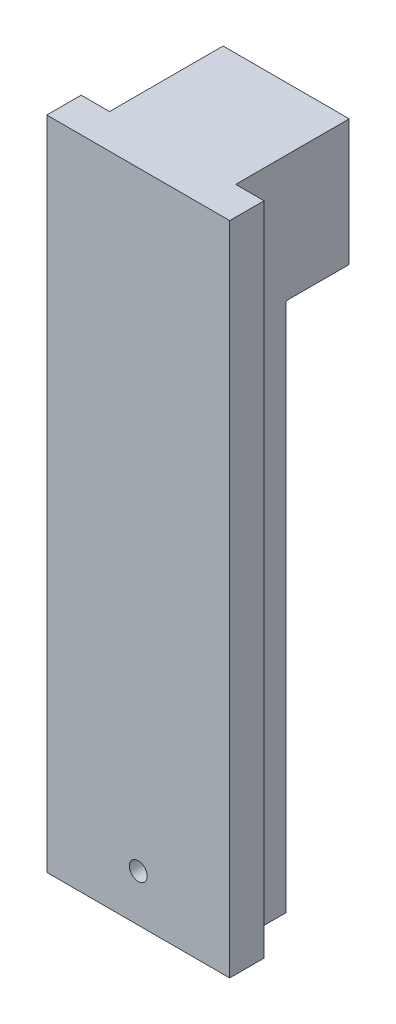
ISO-10303-21;
HEADER;
FILE_DESCRIPTION(('STEP AP214'),'2;1');
FILE_NAME('part.step','',(''),(''),'','','');
FILE_SCHEMA(('AUTOMOTIVE_DESIGN { 1 0 10303 214 1 1 1 1 }'));
ENDSEC;
DATA;
#1=APPLICATION_CONTEXT('core data for automotive mechanical design processes');
#2=APPLICATION_PROTOCOL_DEFINITION('international standard','automotive_design',2000,#1);
#3=PRODUCT_CONTEXT('',#1,'mechanical');
#4=PRODUCT('Part','Part','',(#3));
#5=PRODUCT_RELATED_PRODUCT_CATEGORY('part','',(#4));
#6=PRODUCT_DEFINITION_FORMATION('','',#4);
#7=PRODUCT_DEFINITION_CONTEXT('part definition',#1,'design');
#8=PRODUCT_DEFINITION('design','',#6,#7);
#9=PRODUCT_DEFINITION_SHAPE('','',#8);
#10=(LENGTH_UNIT() NAMED_UNIT(*) SI_UNIT(.MILLI.,.METRE.));
#11=(NAMED_UNIT(*) PLANE_ANGLE_UNIT() SI_UNIT($,.RADIAN.));
#12=(NAMED_UNIT(*) SI_UNIT($,.STERADIAN.) SOLID_ANGLE_UNIT());
#13=UNCERTAINTY_MEASURE_WITH_UNIT(LENGTH_MEASURE(1.E-05),#10,'distance_accuracy_value','');
#14=(GEOMETRIC_REPRESENTATION_CONTEXT(3) GLOBAL_UNCERTAINTY_ASSIGNED_CONTEXT((#13)) GLOBAL_UNIT_ASSIGNED_CONTEXT((#10,
#11,#12)) REPRESENTATION_CONTEXT('',''));
#15=CARTESIAN_POINT('',(0.,0.,0.));
#16=DIRECTION('',(0.,0.,1.));
#17=DIRECTION('',(1.,0.,0.));
#18=AXIS2_PLACEMENT_3D('',#15,#16,#17);
#19=CARTESIAN_POINT('',(10.,104.,-13.45));
#20=DIRECTION('',(0.,0.,1.));
#21=DIRECTION('',(1.,0.,0.));
#22=AXIS2_PLACEMENT_3D('',#19,#20,#21);
#23=PLANE('',#22);
#24=CARTESIAN_POINT('',(0.,7.425,-13.45));
#25=DIRECTION('',(0.,0.,1.));
#26=DIRECTION('',(1.,0.,0.));
#27=AXIS2_PLACEMENT_3D('',#24,#25,#26);
#28=CIRCLE('',#27,1.425);
#29=CARTESIAN_POINT('',(1.425,7.425,-13.45));
#30=VERTEX_POINT('',#29);
#31=EDGE_CURVE('E345',#30,#30,#28,.T.);
#32=ORIENTED_EDGE('',*,*,#31,.T.);
#33=EDGE_LOOP('',(#32));
#34=FACE_BOUND('',#33,.T.);
#35=DIRECTION('',(-1.,0.,0.));
#36=VECTOR('',#35,1.);
#37=CARTESIAN_POINT('',(-10.,84.,-13.45));
#38=LINE('',#37,#36);
#39=CARTESIAN_POINT('',(10.,84.,-13.45));
#40=VERTEX_POINT('',#39);
#41=CARTESIAN_POINT('',(-10.,84.,-13.45));
#42=VERTEX_POINT('',#41);
#43=EDGE_CURVE('E61',#40,#42,#38,.T.);
#44=ORIENTED_EDGE('',*,*,#43,.F.);
#45=DIRECTION('',(0.,-1.,0.));
#46=VECTOR('',#45,1.);
#47=CARTESIAN_POINT('',(10.,104.,-13.45));
#48=LINE('',#47,#46);
#49=CARTESIAN_POINT('',(10.,0.,-13.45));
#50=VERTEX_POINT('',#49);
#51=EDGE_CURVE('E145',#40,#50,#48,.T.);
#52=ORIENTED_EDGE('',*,*,#51,.T.);
#53=DIRECTION('',(-1.,0.,0.));
#54=VECTOR('',#53,1.);
#55=CARTESIAN_POINT('',(10.,0.,-13.45));
#56=LINE('',#55,#54);
#57=CARTESIAN_POINT('',(-10.,0.,-13.45));
#58=VERTEX_POINT('',#57);
#59=EDGE_CURVE('E178',#50,#58,#56,.T.);
#60=ORIENTED_EDGE('',*,*,#59,.T.);
#61=DIRECTION('',(0.,-1.,0.));
#62=VECTOR('',#61,1.);
#63=CARTESIAN_POINT('',(-10.,104.,-13.45));
#64=LINE('',#63,#62);
#65=EDGE_CURVE('E193',#42,#58,#64,.T.);
#66=ORIENTED_EDGE('',*,*,#65,.F.);
#67=EDGE_LOOP('',(#44,#52,#60,#66));
#68=FACE_BOUND('',#67,.T.);
#69=ADVANCED_FACE('F45',(#34,#68),#23,.F.);
#70=CARTESIAN_POINT('',(-14.5,104.,-5.45));
#71=DIRECTION('',(1.,0.,0.));
#72=DIRECTION('',(0.,0.,-1.));
#73=AXIS2_PLACEMENT_3D('',#70,#71,#72);
#74=PLANE('',#73);
#75=DIRECTION('',(0.,0.,1.));
#76=VECTOR('',#75,1.);
#77=CARTESIAN_POINT('',(-14.5,0.,-5.45));
#78=LINE('',#77,#76);
#79=CARTESIAN_POINT('',(-14.5,0.,-5.45));
#80=VERTEX_POINT('',#79);
#81=CARTESIAN_POINT('',(-14.5,0.,0.));
#82=VERTEX_POINT('',#81);
#83=EDGE_CURVE('E162',#80,#82,#78,.T.);
#84=ORIENTED_EDGE('',*,*,#83,.T.);
#85=DIRECTION('',(0.,-1.,0.));
#86=VECTOR('',#85,1.);
#87=CARTESIAN_POINT('',(-14.5,104.,0.));
#88=LINE('',#87,#86);
#89=CARTESIAN_POINT('',(-14.5,104.,0.));
#90=VERTEX_POINT('',#89);
#91=EDGE_CURVE('E11',#90,#82,#88,.T.);
#92=ORIENTED_EDGE('',*,*,#91,.F.);
#93=DIRECTION('',(0.,0.,1.));
#94=VECTOR('',#93,1.);
#95=CARTESIAN_POINT('',(-14.5,104.,-5.45));
#96=LINE('',#95,#94);
#97=CARTESIAN_POINT('',(-14.5,104.,-5.45));
#98=VERTEX_POINT('',#97);
#99=EDGE_CURVE('E187',#98,#90,#96,.T.);
#100=ORIENTED_EDGE('',*,*,#99,.F.);
#101=DIRECTION('',(0.,-1.,0.));
#102=VECTOR('',#101,1.);
#103=CARTESIAN_POINT('',(-14.5,104.,-5.45));
#104=LINE('',#103,#102);
#105=EDGE_CURVE('E161',#98,#80,#104,.T.);
#106=ORIENTED_EDGE('',*,*,#105,.T.);
#107=EDGE_LOOP('',(#84,#92,#100,#106));
#108=FACE_BOUND('',#107,.T.);
#109=ADVANCED_FACE('F47',(#108),#74,.F.);
#110=CARTESIAN_POINT('',(-14.5,104.,0.));
#111=DIRECTION('',(0.,0.,-1.));
#112=DIRECTION('',(-1.,0.,0.));
#113=AXIS2_PLACEMENT_3D('',#110,#111,#112);
#114=PLANE('',#113);
#115=CARTESIAN_POINT('',(0.,7.425,0.));
#116=DIRECTION('',(0.,0.,1.));
#117=DIRECTION('',(1.,0.,0.));
#118=AXIS2_PLACEMENT_3D('',#115,#116,#117);
#119=CIRCLE('',#118,1.425);
#120=CARTESIAN_POINT('',(1.425,7.425,0.));
#121=VERTEX_POINT('',#120);
#122=EDGE_CURVE('E343',#121,#121,#119,.T.);
#123=ORIENTED_EDGE('',*,*,#122,.F.);
#124=EDGE_LOOP('',(#123));
#125=FACE_BOUND('',#124,.T.);
#126=DIRECTION('',(1.,0.,0.));
#127=VECTOR('',#126,1.);
#128=CARTESIAN_POINT('',(-14.5,0.,0.));
#129=LINE('',#128,#127);
#130=CARTESIAN_POINT('',(14.5,0.,0.));
#131=VERTEX_POINT('',#130);
#132=EDGE_CURVE('E166',#82,#131,#129,.T.);
#133=ORIENTED_EDGE('',*,*,#132,.T.);
#134=DIRECTION('',(0.,-1.,0.));
#135=VECTOR('',#134,1.);
#136=CARTESIAN_POINT('',(14.5,104.,0.));
#137=LINE('',#136,#135);
#138=CARTESIAN_POINT('',(14.5,104.,0.));
#139=VERTEX_POINT('',#138);
#140=EDGE_CURVE('E54',#139,#131,#137,.T.);
#141=ORIENTED_EDGE('',*,*,#140,.F.);
#142=DIRECTION('',(1.,0.,0.));
#143=VECTOR('',#142,1.);
#144=CARTESIAN_POINT('',(-14.5,104.,0.));
#145=LINE('',#144,#143);
#146=EDGE_CURVE('E110',#90,#139,#145,.T.);
#147=ORIENTED_EDGE('',*,*,#146,.F.);
#148=ORIENTED_EDGE('',*,*,#91,.T.);
#149=EDGE_LOOP('',(#133,#141,#147,#148));
#150=FACE_BOUND('',#149,.T.);
#151=ADVANCED_FACE('F233',(#125,#150),#114,.F.);
#152=CARTESIAN_POINT('',(14.5,104.,0.));
#153=DIRECTION('',(-1.,0.,0.));
#154=DIRECTION('',(0.,0.,1.));
#155=AXIS2_PLACEMENT_3D('',#152,#153,#154);
#156=PLANE('',#155);
#157=DIRECTION('',(0.,0.,-1.));
#158=VECTOR('',#157,1.);
#159=CARTESIAN_POINT('',(14.5,0.,0.));
#160=LINE('',#159,#158);
#161=CARTESIAN_POINT('',(14.5,0.,-5.45000000000001));
#162=VERTEX_POINT('',#161);
#163=EDGE_CURVE('E170',#131,#162,#160,.T.);
#164=ORIENTED_EDGE('',*,*,#163,.T.);
#165=DIRECTION('',(0.,-1.,0.));
#166=VECTOR('',#165,1.);
#167=CARTESIAN_POINT('',(14.5,104.,-5.45000000000001));
#168=LINE('',#167,#166);
#169=CARTESIAN_POINT('',(14.5,104.,-5.45000000000001));
#170=VERTEX_POINT('',#169);
#171=EDGE_CURVE('E144',#170,#162,#168,.T.);
#172=ORIENTED_EDGE('',*,*,#171,.F.);
#173=DIRECTION('',(0.,0.,-1.));
#174=VECTOR('',#173,1.);
#175=CARTESIAN_POINT('',(14.5,104.,0.));
#176=LINE('',#175,#174);
#177=EDGE_CURVE('E129',#139,#170,#176,.T.);
#178=ORIENTED_EDGE('',*,*,#177,.F.);
#179=ORIENTED_EDGE('',*,*,#140,.T.);
#180=EDGE_LOOP('',(#164,#172,#178,#179));
#181=FACE_BOUND('',#180,.T.);
#182=ADVANCED_FACE('F203',(#181),#156,.F.);
#183=CARTESIAN_POINT('',(14.5,104.,-5.45000000000001));
#184=DIRECTION('',(0.,0.,1.));
#185=DIRECTION('',(1.,0.,0.));
#186=AXIS2_PLACEMENT_3D('',#183,#184,#185);
#187=PLANE('',#186);
#188=DIRECTION('',(-1.,0.,0.));
#189=VECTOR('',#188,1.);
#190=CARTESIAN_POINT('',(14.5,0.,-5.45000000000001));
#191=LINE('',#190,#189);
#192=CARTESIAN_POINT('',(10.,0.,-5.45000000000001));
#193=VERTEX_POINT('',#192);
#194=EDGE_CURVE('E139',#162,#193,#191,.T.);
#195=ORIENTED_EDGE('',*,*,#194,.T.);
#196=DIRECTION('',(0.,-1.,0.));
#197=VECTOR('',#196,1.);
#198=CARTESIAN_POINT('',(10.,104.,-5.45000000000001));
#199=LINE('',#198,#197);
#200=CARTESIAN_POINT('',(10.,104.,-5.45000000000001));
#201=VERTEX_POINT('',#200);
#202=EDGE_CURVE('E136',#201,#193,#199,.T.);
#203=ORIENTED_EDGE('',*,*,#202,.F.);
#204=DIRECTION('',(-1.,0.,0.));
#205=VECTOR('',#204,1.);
#206=CARTESIAN_POINT('',(14.5,104.,-5.45000000000001));
#207=LINE('',#206,#205);
#208=EDGE_CURVE('E121',#170,#201,#207,.T.);
#209=ORIENTED_EDGE('',*,*,#208,.F.);
#210=ORIENTED_EDGE('',*,*,#171,.T.);
#211=EDGE_LOOP('',(#195,#203,#209,#210));
#212=FACE_BOUND('',#211,.T.);
#213=ADVANCED_FACE('F137',(#212),#187,.F.);
#214=CARTESIAN_POINT('',(10.,104.,-5.45000000000001));
#215=DIRECTION('',(-1.,0.,0.));
#216=DIRECTION('',(0.,0.,1.));
#217=AXIS2_PLACEMENT_3D('',#214,#215,#216);
#218=PLANE('',#217);
#219=DIRECTION('',(0.,0.,-1.));
#220=VECTOR('',#219,1.);
#221=CARTESIAN_POINT('',(10.,0.,-5.45000000000001));
#222=LINE('',#221,#220);
#223=EDGE_CURVE('E175',#193,#50,#222,.T.);
#224=ORIENTED_EDGE('',*,*,#223,.T.);
#225=ORIENTED_EDGE('',*,*,#51,.F.);
#226=DIRECTION('',(0.,0.,1.));
#227=VECTOR('',#226,1.);
#228=CARTESIAN_POINT('',(10.,84.,-23.45));
#229=LINE('',#228,#227);
#230=CARTESIAN_POINT('',(10.,84.,-23.45));
#231=VERTEX_POINT('',#230);
#232=EDGE_CURVE('E167',#231,#40,#229,.T.);
#233=ORIENTED_EDGE('',*,*,#232,.F.);
#234=DIRECTION('',(0.,-1.,0.));
#235=VECTOR('',#234,1.);
#236=CARTESIAN_POINT('',(10.,84.,-23.45));
#237=LINE('',#236,#235);
#238=CARTESIAN_POINT('',(10.,104.,-23.45));
#239=VERTEX_POINT('',#238);
#240=EDGE_CURVE('E151',#239,#231,#237,.T.);
#241=ORIENTED_EDGE('',*,*,#240,.F.);
#242=DIRECTION('',(0.,0.,-1.));
#243=VECTOR('',#242,1.);
#244=CARTESIAN_POINT('',(10.,104.,-5.45000000000001));
#245=LINE('',#244,#243);
#246=EDGE_CURVE('E126',#201,#239,#245,.T.);
#247=ORIENTED_EDGE('',*,*,#246,.F.);
#248=ORIENTED_EDGE('',*,*,#202,.T.);
#249=EDGE_LOOP('',(#224,#225,#233,#241,#247,#248));
#250=FACE_BOUND('',#249,.T.);
#251=ADVANCED_FACE('F148',(#250),#218,.F.);
#252=CARTESIAN_POINT('',(-10.,104.,-13.45));
#253=DIRECTION('',(1.,0.,0.));
#254=DIRECTION('',(0.,0.,-1.));
#255=AXIS2_PLACEMENT_3D('',#252,#253,#254);
#256=PLANE('',#255);
#257=DIRECTION('',(0.,0.,1.));
#258=VECTOR('',#257,1.);
#259=CARTESIAN_POINT('',(-10.,0.,-13.45));
#260=LINE('',#259,#258);
#261=CARTESIAN_POINT('',(-10.,0.,-5.45));
#262=VERTEX_POINT('',#261);
#263=EDGE_CURVE('E182',#58,#262,#260,.T.);
#264=ORIENTED_EDGE('',*,*,#263,.T.);
#265=DIRECTION('',(0.,-1.,0.));
#266=VECTOR('',#265,1.);
#267=CARTESIAN_POINT('',(-10.,104.,-5.45));
#268=LINE('',#267,#266);
#269=CARTESIAN_POINT('',(-10.,104.,-5.45));
#270=VERTEX_POINT('',#269);
#271=EDGE_CURVE('E190',#270,#262,#268,.T.);
#272=ORIENTED_EDGE('',*,*,#271,.F.);
#273=DIRECTION('',(0.,0.,1.));
#274=VECTOR('',#273,1.);
#275=CARTESIAN_POINT('',(-10.,104.,-13.45));
#276=LINE('',#275,#274);
#277=CARTESIAN_POINT('',(-10.,104.,-23.45));
#278=VERTEX_POINT('',#277);
#279=EDGE_CURVE('E153',#278,#270,#276,.T.);
#280=ORIENTED_EDGE('',*,*,#279,.F.);
#281=DIRECTION('',(0.,1.,0.));
#282=VECTOR('',#281,1.);
#283=CARTESIAN_POINT('',(-10.,104.,-23.45));
#284=LINE('',#283,#282);
#285=CARTESIAN_POINT('',(-10.,84.,-23.45));
#286=VERTEX_POINT('',#285);
#287=EDGE_CURVE('E363',#286,#278,#284,.T.);
#288=ORIENTED_EDGE('',*,*,#287,.F.);
#289=DIRECTION('',(0.,0.,1.));
#290=VECTOR('',#289,1.);
#291=CARTESIAN_POINT('',(-10.,84.,-23.45));
#292=LINE('',#291,#290);
#293=EDGE_CURVE('E219',#286,#42,#292,.T.);
#294=ORIENTED_EDGE('',*,*,#293,.T.);
#295=ORIENTED_EDGE('',*,*,#65,.T.);
#296=EDGE_LOOP('',(#264,#272,#280,#288,#294,#295));
#297=FACE_BOUND('',#296,.T.);
#298=ADVANCED_FACE('F252',(#297),#256,.F.);
#299=CARTESIAN_POINT('',(-10.,104.,-5.45));
#300=DIRECTION('',(0.,0.,1.));
#301=DIRECTION('',(1.,0.,0.));
#302=AXIS2_PLACEMENT_3D('',#299,#300,#301);
#303=PLANE('',#302);
#304=DIRECTION('',(-1.,0.,0.));
#305=VECTOR('',#304,1.);
#306=CARTESIAN_POINT('',(-10.,0.,-5.45));
#307=LINE('',#306,#305);
#308=EDGE_CURVE('E102',#262,#80,#307,.T.);
#309=ORIENTED_EDGE('',*,*,#308,.T.);
#310=ORIENTED_EDGE('',*,*,#105,.F.);
#311=DIRECTION('',(-1.,0.,0.));
#312=VECTOR('',#311,1.);
#313=CARTESIAN_POINT('',(-10.,104.,-5.45));
#314=LINE('',#313,#312);
#315=EDGE_CURVE('E70',#270,#98,#314,.T.);
#316=ORIENTED_EDGE('',*,*,#315,.F.);
#317=ORIENTED_EDGE('',*,*,#271,.T.);
#318=EDGE_LOOP('',(#309,#310,#316,#317));
#319=FACE_BOUND('',#318,.T.);
#320=ADVANCED_FACE('F266',(#319),#303,.F.);
#321=CARTESIAN_POINT('',(0.,104.,0.));
#322=DIRECTION('',(0.,1.,0.));
#323=DIRECTION('',(0.,0.,1.));
#324=AXIS2_PLACEMENT_3D('',#321,#322,#323);
#325=PLANE('',#324);
#326=ORIENTED_EDGE('',*,*,#99,.T.);
#327=ORIENTED_EDGE('',*,*,#146,.T.);
#328=ORIENTED_EDGE('',*,*,#177,.T.);
#329=ORIENTED_EDGE('',*,*,#208,.T.);
#330=ORIENTED_EDGE('',*,*,#246,.T.);
#331=DIRECTION('',(1.,0.,0.));
#332=VECTOR('',#331,1.);
#333=CARTESIAN_POINT('',(10.,104.,-23.45));
#334=LINE('',#333,#332);
#335=EDGE_CURVE('E222',#278,#239,#334,.T.);
#336=ORIENTED_EDGE('',*,*,#335,.F.);
#337=ORIENTED_EDGE('',*,*,#279,.T.);
#338=ORIENTED_EDGE('',*,*,#315,.T.);
#339=EDGE_LOOP('',(#326,#327,#328,#329,#330,#336,#337,#338));
#340=FACE_BOUND('',#339,.T.);
#341=ADVANCED_FACE('F123',(#340),#325,.T.);
#342=CARTESIAN_POINT('',(0.,0.,0.));
#343=DIRECTION('',(0.,1.,0.));
#344=DIRECTION('',(0.,0.,1.));
#345=AXIS2_PLACEMENT_3D('',#342,#343,#344);
#346=PLANE('',#345);
#347=ORIENTED_EDGE('',*,*,#83,.F.);
#348=ORIENTED_EDGE('',*,*,#308,.F.);
#349=ORIENTED_EDGE('',*,*,#263,.F.);
#350=ORIENTED_EDGE('',*,*,#59,.F.);
#351=ORIENTED_EDGE('',*,*,#223,.F.);
#352=ORIENTED_EDGE('',*,*,#194,.F.);
#353=ORIENTED_EDGE('',*,*,#163,.F.);
#354=ORIENTED_EDGE('',*,*,#132,.F.);
#355=EDGE_LOOP('',(#347,#348,#349,#350,#351,#352,#353,#354));
#356=FACE_BOUND('',#355,.T.);
#357=ADVANCED_FACE('F206',(#356),#346,.F.);
#358=CARTESIAN_POINT('',(-10.,84.,-23.45));
#359=DIRECTION('',(0.,1.,0.));
#360=DIRECTION('',(0.,0.,1.));
#361=AXIS2_PLACEMENT_3D('',#358,#359,#360);
#362=PLANE('',#361);
#363=ORIENTED_EDGE('',*,*,#43,.T.);
#364=ORIENTED_EDGE('',*,*,#293,.F.);
#365=DIRECTION('',(-1.,0.,0.));
#366=VECTOR('',#365,1.);
#367=CARTESIAN_POINT('',(-10.,84.,-23.45));
#368=LINE('',#367,#366);
#369=EDGE_CURVE('E217',#231,#286,#368,.T.);
#370=ORIENTED_EDGE('',*,*,#369,.F.);
#371=ORIENTED_EDGE('',*,*,#232,.T.);
#372=EDGE_LOOP('',(#363,#364,#370,#371));
#373=FACE_BOUND('',#372,.T.);
#374=ADVANCED_FACE('F213',(#373),#362,.F.);
#375=CARTESIAN_POINT('',(0.,0.,-23.45));
#376=DIRECTION('',(0.,0.,1.));
#377=DIRECTION('',(1.,0.,0.));
#378=AXIS2_PLACEMENT_3D('',#375,#376,#377);
#379=PLANE('',#378);
#380=CARTESIAN_POINT('',(0.,94.,-23.45));
#381=DIRECTION('',(0.,0.,-1.));
#382=DIRECTION('',(-1.,0.,0.));
#383=AXIS2_PLACEMENT_3D('',#380,#381,#382);
#384=CIRCLE('',#383,2.5);
#385=CARTESIAN_POINT('',(-2.50000000000001,94.,-23.45));
#386=VERTEX_POINT('',#385);
#387=EDGE_CURVE('E347',#386,#386,#384,.T.);
#388=ORIENTED_EDGE('',*,*,#387,.F.);
#389=EDGE_LOOP('',(#388));
#390=FACE_BOUND('',#389,.T.);
#391=ORIENTED_EDGE('',*,*,#240,.T.);
#392=ORIENTED_EDGE('',*,*,#369,.T.);
#393=ORIENTED_EDGE('',*,*,#287,.T.);
#394=ORIENTED_EDGE('',*,*,#335,.T.);
#395=EDGE_LOOP('',(#391,#392,#393,#394));
#396=FACE_BOUND('',#395,.T.);
#397=ADVANCED_FACE('F302',(#390,#396),#379,.F.);
#398=CARTESIAN_POINT('',(0.,94.,-13.45));
#399=DIRECTION('',(0.,0.,-1.));
#400=DIRECTION('',(-1.,0.,0.));
#401=AXIS2_PLACEMENT_3D('',#398,#399,#400);
#402=CYLINDRICAL_SURFACE('',#401,2.5);
#403=CARTESIAN_POINT('',(0.,94.,-13.45));
#404=DIRECTION('',(0.,0.,-1.));
#405=DIRECTION('',(-1.,0.,0.));
#406=AXIS2_PLACEMENT_3D('',#403,#404,#405);
#407=CIRCLE('',#406,2.5);
#408=CARTESIAN_POINT('',(-2.50000000000001,94.,-13.45));
#409=VERTEX_POINT('',#408);
#410=EDGE_CURVE('E352',#409,#409,#407,.T.);
#411=ORIENTED_EDGE('',*,*,#410,.F.);
#412=EDGE_LOOP('',(#411));
#413=FACE_BOUND('',#412,.T.);
#414=ORIENTED_EDGE('',*,*,#387,.T.);
#415=EDGE_LOOP('',(#414));
#416=FACE_BOUND('',#415,.T.);
#417=ADVANCED_FACE('F310',(#413,#416),#402,.F.);
#418=CARTESIAN_POINT('',(0.,94.,-13.45));
#419=DIRECTION('',(0.,0.,-1.));
#420=DIRECTION('',(-1.,0.,0.));
#421=AXIS2_PLACEMENT_3D('',#418,#419,#420);
#422=PLANE('',#421);
#423=ORIENTED_EDGE('',*,*,#410,.T.);
#424=EDGE_LOOP('',(#423));
#425=FACE_BOUND('',#424,.T.);
#426=ADVANCED_FACE('F318',(#425),#422,.T.);
#427=CARTESIAN_POINT('',(0.,7.425,-23.45));
#428=DIRECTION('',(0.,0.,1.));
#429=DIRECTION('',(1.,0.,0.));
#430=AXIS2_PLACEMENT_3D('',#427,#428,#429);
#431=CYLINDRICAL_SURFACE('',#430,1.425);
#432=ORIENTED_EDGE('',*,*,#122,.T.);
#433=EDGE_LOOP('',(#432));
#434=FACE_BOUND('',#433,.T.);
#435=ORIENTED_EDGE('',*,*,#31,.F.);
#436=EDGE_LOOP('',(#435));
#437=FACE_BOUND('',#436,.T.);
#438=ADVANCED_FACE('F326',(#434,#437),#431,.F.);
#439=CLOSED_SHELL('',(#69,#109,#151,#182,#213,#251,#298,#320,#341,#357,#374,#397,#417,#426,#438));
#440=MANIFOLD_SOLID_BREP('B2',#439);
#441=ADVANCED_BREP_SHAPE_REPRESENTATION('',(#18,#440),#14);
#442=SHAPE_DEFINITION_REPRESENTATION(#9,#441);
ENDSEC;
END-ISO-10303-21;
